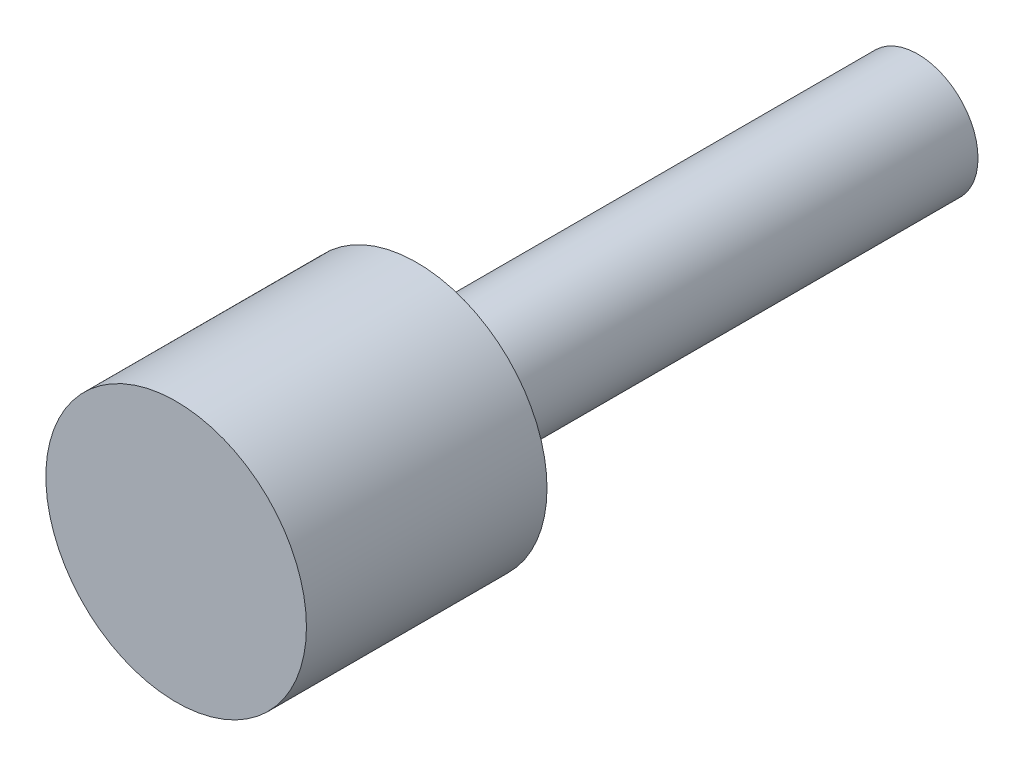
ISO-10303-21;
HEADER;
FILE_DESCRIPTION(('STEP AP214'),'2;1');
FILE_NAME('part.step','',(''),(''),'','','');
FILE_SCHEMA(('AUTOMOTIVE_DESIGN { 1 0 10303 214 1 1 1 1 }'));
ENDSEC;
DATA;
#1=APPLICATION_CONTEXT('core data for automotive mechanical design processes');
#2=APPLICATION_PROTOCOL_DEFINITION('international standard','automotive_design',2000,#1);
#3=PRODUCT_CONTEXT('',#1,'mechanical');
#4=PRODUCT('Part','Part','',(#3));
#5=PRODUCT_RELATED_PRODUCT_CATEGORY('part','',(#4));
#6=PRODUCT_DEFINITION_FORMATION('','',#4);
#7=PRODUCT_DEFINITION_CONTEXT('part definition',#1,'design');
#8=PRODUCT_DEFINITION('design','',#6,#7);
#9=PRODUCT_DEFINITION_SHAPE('','',#8);
#10=(LENGTH_UNIT() NAMED_UNIT(*) SI_UNIT(.MILLI.,.METRE.));
#11=(NAMED_UNIT(*) PLANE_ANGLE_UNIT() SI_UNIT($,.RADIAN.));
#12=(NAMED_UNIT(*) SI_UNIT($,.STERADIAN.) SOLID_ANGLE_UNIT());
#13=UNCERTAINTY_MEASURE_WITH_UNIT(LENGTH_MEASURE(1.E-05),#10,'distance_accuracy_value','');
#14=(GEOMETRIC_REPRESENTATION_CONTEXT(3) GLOBAL_UNCERTAINTY_ASSIGNED_CONTEXT((#13)) GLOBAL_UNIT_ASSIGNED_CONTEXT((#10,
#11,#12)) REPRESENTATION_CONTEXT('',''));
#15=CARTESIAN_POINT('',(0.,0.,0.));
#16=DIRECTION('',(0.,0.,1.));
#17=DIRECTION('',(1.,0.,0.));
#18=AXIS2_PLACEMENT_3D('',#15,#16,#17);
#19=CARTESIAN_POINT('',(0.,0.,12.5));
#20=DIRECTION('',(0.,0.,-1.));
#21=DIRECTION('',(-1.,0.,0.));
#22=AXIS2_PLACEMENT_3D('',#19,#20,#21);
#23=CYLINDRICAL_SURFACE('',#22,3.);
#24=CARTESIAN_POINT('',(0.,0.,12.5));
#25=DIRECTION('',(0.,0.,1.));
#26=DIRECTION('',(1.,0.,0.));
#27=AXIS2_PLACEMENT_3D('',#24,#25,#26);
#28=CIRCLE('',#27,3.);
#29=CARTESIAN_POINT('',(3.,0.,12.5));
#30=VERTEX_POINT('',#29);
#31=EDGE_CURVE('E10',#30,#30,#28,.T.);
#32=ORIENTED_EDGE('',*,*,#31,.F.);
#33=EDGE_LOOP('',(#32));
#34=FACE_BOUND('',#33,.T.);
#35=CARTESIAN_POINT('',(0.,0.,-12.5));
#36=DIRECTION('',(0.,0.,1.));
#37=DIRECTION('',(1.,0.,0.));
#38=AXIS2_PLACEMENT_3D('',#35,#36,#37);
#39=CIRCLE('',#38,3.);
#40=CARTESIAN_POINT('',(3.,0.,-12.5));
#41=VERTEX_POINT('',#40);
#42=EDGE_CURVE('E37',#41,#41,#39,.T.);
#43=ORIENTED_EDGE('',*,*,#42,.T.);
#44=EDGE_LOOP('',(#43));
#45=FACE_BOUND('',#44,.T.);
#46=ADVANCED_FACE('F34',(#34,#45),#23,.T.);
#47=CARTESIAN_POINT('',(0.,0.,-12.5));
#48=DIRECTION('',(0.,0.,1.));
#49=DIRECTION('',(1.,0.,0.));
#50=AXIS2_PLACEMENT_3D('',#47,#48,#49);
#51=PLANE('',#50);
#52=ORIENTED_EDGE('',*,*,#42,.F.);
#53=EDGE_LOOP('',(#52));
#54=FACE_BOUND('',#53,.T.);
#55=ADVANCED_FACE('F57',(#54),#51,.F.);
#56=CARTESIAN_POINT('',(0.,0.,24.5));
#57=DIRECTION('',(0.,0.,-1.));
#58=DIRECTION('',(-1.,0.,0.));
#59=AXIS2_PLACEMENT_3D('',#56,#57,#58);
#60=CYLINDRICAL_SURFACE('',#59,6.5);
#61=CARTESIAN_POINT('',(0.,0.,24.5));
#62=DIRECTION('',(0.,0.,1.));
#63=DIRECTION('',(1.,0.,0.));
#64=AXIS2_PLACEMENT_3D('',#61,#62,#63);
#65=CIRCLE('',#64,6.5);
#66=CARTESIAN_POINT('',(6.5,0.,24.5));
#67=VERTEX_POINT('',#66);
#68=EDGE_CURVE('E44',#67,#67,#65,.T.);
#69=ORIENTED_EDGE('',*,*,#68,.F.);
#70=EDGE_LOOP('',(#69));
#71=FACE_BOUND('',#70,.T.);
#72=CARTESIAN_POINT('',(0.,0.,12.5));
#73=DIRECTION('',(0.,0.,1.));
#74=DIRECTION('',(1.,0.,0.));
#75=AXIS2_PLACEMENT_3D('',#72,#73,#74);
#76=CIRCLE('',#75,6.5);
#77=CARTESIAN_POINT('',(6.5,0.,12.5));
#78=VERTEX_POINT('',#77);
#79=EDGE_CURVE('E46',#78,#78,#76,.T.);
#80=ORIENTED_EDGE('',*,*,#79,.T.);
#81=EDGE_LOOP('',(#80));
#82=FACE_BOUND('',#81,.T.);
#83=ADVANCED_FACE('F54',(#71,#82),#60,.T.);
#84=CARTESIAN_POINT('',(0.,0.,24.5));
#85=DIRECTION('',(0.,0.,1.));
#86=DIRECTION('',(1.,0.,0.));
#87=AXIS2_PLACEMENT_3D('',#84,#85,#86);
#88=PLANE('',#87);
#89=ORIENTED_EDGE('',*,*,#68,.T.);
#90=EDGE_LOOP('',(#89));
#91=FACE_BOUND('',#90,.T.);
#92=ADVANCED_FACE('F52',(#91),#88,.T.);
#93=CARTESIAN_POINT('',(0.,0.,12.5));
#94=DIRECTION('',(0.,0.,1.));
#95=DIRECTION('',(1.,0.,0.));
#96=AXIS2_PLACEMENT_3D('',#93,#94,#95);
#97=PLANE('',#96);
#98=ORIENTED_EDGE('',*,*,#31,.T.);
#99=EDGE_LOOP('',(#98));
#100=FACE_BOUND('',#99,.T.);
#101=ORIENTED_EDGE('',*,*,#79,.F.);
#102=EDGE_LOOP('',(#101));
#103=FACE_BOUND('',#102,.T.);
#104=ADVANCED_FACE('F61',(#100,#103),#97,.F.);
#105=CLOSED_SHELL('',(#46,#55,#83,#92,#104));
#106=MANIFOLD_SOLID_BREP('B2',#105);
#107=ADVANCED_BREP_SHAPE_REPRESENTATION('',(#18,#106),#14);
#108=SHAPE_DEFINITION_REPRESENTATION(#9,#107);
ENDSEC;
END-ISO-10303-21;
